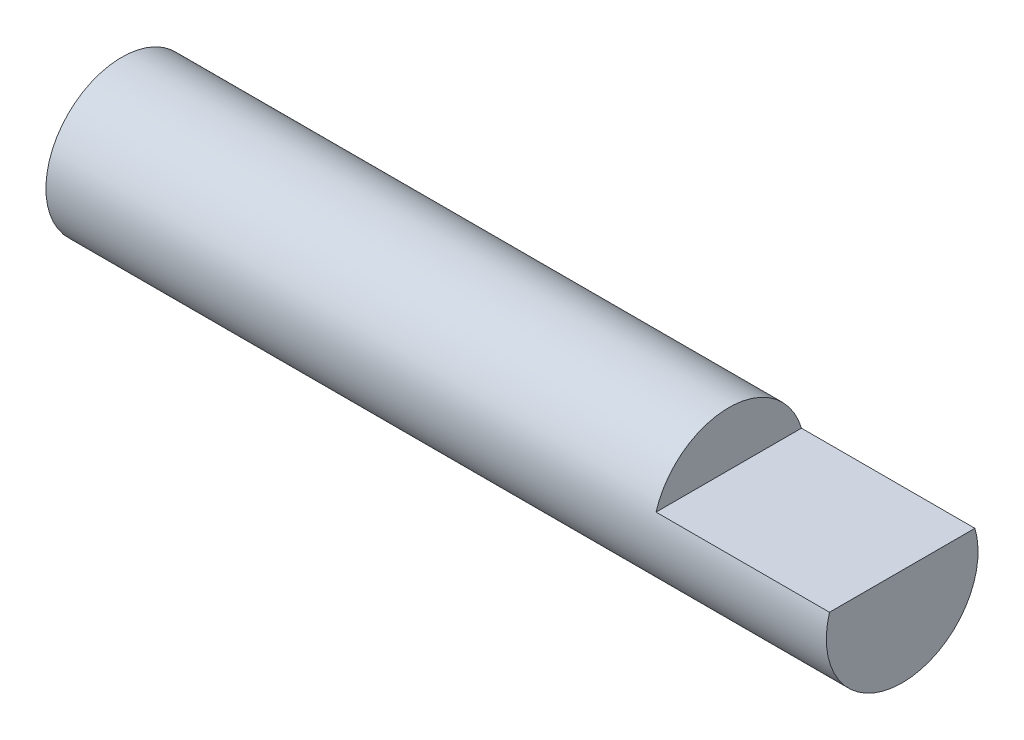
ISO-10303-21;
HEADER;
FILE_DESCRIPTION(('STEP AP214'),'2;1');
FILE_NAME('part.step','',(''),(''),'','','');
FILE_SCHEMA(('AUTOMOTIVE_DESIGN { 1 0 10303 214 1 1 1 1 }'));
ENDSEC;
DATA;
#1=APPLICATION_CONTEXT('core data for automotive mechanical design processes');
#2=APPLICATION_PROTOCOL_DEFINITION('international standard','automotive_design',2000,#1);
#3=PRODUCT_CONTEXT('',#1,'mechanical');
#4=PRODUCT('Part','Part','',(#3));
#5=PRODUCT_RELATED_PRODUCT_CATEGORY('part','',(#4));
#6=PRODUCT_DEFINITION_FORMATION('','',#4);
#7=PRODUCT_DEFINITION_CONTEXT('part definition',#1,'design');
#8=PRODUCT_DEFINITION('design','',#6,#7);
#9=PRODUCT_DEFINITION_SHAPE('','',#8);
#10=(LENGTH_UNIT() NAMED_UNIT(*) SI_UNIT(.MILLI.,.METRE.));
#11=(NAMED_UNIT(*) PLANE_ANGLE_UNIT() SI_UNIT($,.RADIAN.));
#12=(NAMED_UNIT(*) SI_UNIT($,.STERADIAN.) SOLID_ANGLE_UNIT());
#13=UNCERTAINTY_MEASURE_WITH_UNIT(LENGTH_MEASURE(1.E-05),#10,'distance_accuracy_value','');
#14=(GEOMETRIC_REPRESENTATION_CONTEXT(3) GLOBAL_UNCERTAINTY_ASSIGNED_CONTEXT((#13)) GLOBAL_UNIT_ASSIGNED_CONTEXT((#10,
#11,#12)) REPRESENTATION_CONTEXT('',''));
#15=CARTESIAN_POINT('',(0.,0.,0.));
#16=DIRECTION('',(0.,0.,1.));
#17=DIRECTION('',(1.,0.,0.));
#18=AXIS2_PLACEMENT_3D('',#15,#16,#17);
#19=CARTESIAN_POINT('',(57.15,0.,0.));
#20=DIRECTION('',(-1.,0.,0.));
#21=DIRECTION('',(0.,0.,1.));
#22=AXIS2_PLACEMENT_3D('',#19,#20,#21);
#23=CYLINDRICAL_SURFACE('',#22,5.55625);
#24=CARTESIAN_POINT('',(57.15,0.,0.));
#25=DIRECTION('',(1.,0.,0.));
#26=DIRECTION('',(0.,0.,-1.));
#27=AXIS2_PLACEMENT_3D('',#24,#25,#26);
#28=CIRCLE('',#27,5.55625);
#29=CARTESIAN_POINT('',(57.15,1.5875,5.32463687142137));
#30=VERTEX_POINT('',#29);
#31=CARTESIAN_POINT('',(57.15,1.5875,-5.32463687142137));
#32=VERTEX_POINT('',#31);
#33=EDGE_CURVE('E11',#30,#32,#28,.T.);
#34=ORIENTED_EDGE('',*,*,#33,.F.);
#35=DIRECTION('',(1.,0.,0.));
#36=VECTOR('',#35,1.);
#37=CARTESIAN_POINT('',(44.45,1.5875,5.32463687142137));
#38=LINE('',#37,#36);
#39=CARTESIAN_POINT('',(44.45,1.5875,5.32463687142137));
#40=VERTEX_POINT('',#39);
#41=EDGE_CURVE('E50',#40,#30,#38,.T.);
#42=ORIENTED_EDGE('',*,*,#41,.F.);
#43=CARTESIAN_POINT('',(44.45,0.,0.));
#44=DIRECTION('',(1.,0.,0.));
#45=DIRECTION('',(0.,0.,-1.));
#46=AXIS2_PLACEMENT_3D('',#43,#44,#45);
#47=CIRCLE('',#46,5.55625);
#48=CARTESIAN_POINT('',(44.45,1.5875,-5.32463687142137));
#49=VERTEX_POINT('',#48);
#50=EDGE_CURVE('E65',#49,#40,#47,.T.);
#51=ORIENTED_EDGE('',*,*,#50,.F.);
#52=DIRECTION('',(1.,0.,0.));
#53=VECTOR('',#52,1.);
#54=CARTESIAN_POINT('',(44.45,1.5875,-5.32463687142137));
#55=LINE('',#54,#53);
#56=EDGE_CURVE('E56',#49,#32,#55,.T.);
#57=ORIENTED_EDGE('',*,*,#56,.T.);
#58=EDGE_LOOP('',(#34,#42,#51,#57));
#59=FACE_BOUND('',#58,.T.);
#60=CARTESIAN_POINT('',(0.,0.,0.));
#61=DIRECTION('',(1.,0.,0.));
#62=DIRECTION('',(0.,0.,-1.));
#63=AXIS2_PLACEMENT_3D('',#60,#61,#62);
#64=CIRCLE('',#63,5.55625);
#65=CARTESIAN_POINT('',(0.,0.,-5.55625));
#66=VERTEX_POINT('',#65);
#67=EDGE_CURVE('E39',#66,#66,#64,.T.);
#68=ORIENTED_EDGE('',*,*,#67,.T.);
#69=EDGE_LOOP('',(#68));
#70=FACE_BOUND('',#69,.T.);
#71=ADVANCED_FACE('F36',(#59,#70),#23,.T.);
#72=CARTESIAN_POINT('',(57.15,0.,0.));
#73=DIRECTION('',(1.,0.,0.));
#74=DIRECTION('',(0.,0.,-1.));
#75=AXIS2_PLACEMENT_3D('',#72,#73,#74);
#76=PLANE('',#75);
#77=DIRECTION('',(0.,0.,-1.));
#78=VECTOR('',#77,1.);
#79=CARTESIAN_POINT('',(57.15,1.5875,5.32463687142137));
#80=LINE('',#79,#78);
#81=EDGE_CURVE('E61',#30,#32,#80,.T.);
#82=ORIENTED_EDGE('',*,*,#81,.F.);
#83=ORIENTED_EDGE('',*,*,#33,.T.);
#84=EDGE_LOOP('',(#82,#83));
#85=FACE_BOUND('',#84,.T.);
#86=ADVANCED_FACE('F72',(#85),#76,.T.);
#87=CARTESIAN_POINT('',(0.,0.,0.));
#88=DIRECTION('',(1.,0.,0.));
#89=DIRECTION('',(0.,0.,-1.));
#90=AXIS2_PLACEMENT_3D('',#87,#88,#89);
#91=PLANE('',#90);
#92=ORIENTED_EDGE('',*,*,#67,.F.);
#93=EDGE_LOOP('',(#92));
#94=FACE_BOUND('',#93,.T.);
#95=ADVANCED_FACE('F74',(#94),#91,.F.);
#96=CARTESIAN_POINT('',(44.45,1.5875,5.32463687142137));
#97=DIRECTION('',(0.,-1.,0.));
#98=DIRECTION('',(0.,0.,-1.));
#99=AXIS2_PLACEMENT_3D('',#96,#97,#98);
#100=PLANE('',#99);
#101=ORIENTED_EDGE('',*,*,#81,.T.);
#102=ORIENTED_EDGE('',*,*,#56,.F.);
#103=DIRECTION('',(0.,0.,-1.));
#104=VECTOR('',#103,1.);
#105=CARTESIAN_POINT('',(44.45,1.5875,5.32463687142137));
#106=LINE('',#105,#104);
#107=EDGE_CURVE('E89',#40,#49,#106,.T.);
#108=ORIENTED_EDGE('',*,*,#107,.F.);
#109=ORIENTED_EDGE('',*,*,#41,.T.);
#110=EDGE_LOOP('',(#101,#102,#108,#109));
#111=FACE_BOUND('',#110,.T.);
#112=ADVANCED_FACE('F62',(#111),#100,.F.);
#113=CARTESIAN_POINT('',(44.45,0.,0.));
#114=DIRECTION('',(1.,0.,0.));
#115=DIRECTION('',(0.,0.,-1.));
#116=AXIS2_PLACEMENT_3D('',#113,#114,#115);
#117=PLANE('',#116);
#118=ORIENTED_EDGE('',*,*,#50,.T.);
#119=ORIENTED_EDGE('',*,*,#107,.T.);
#120=EDGE_LOOP('',(#118,#119));
#121=FACE_BOUND('',#120,.T.);
#122=ADVANCED_FACE('F84',(#121),#117,.T.);
#123=CLOSED_SHELL('',(#71,#86,#95,#112,#122));
#124=MANIFOLD_SOLID_BREP('B2',#123);
#125=ADVANCED_BREP_SHAPE_REPRESENTATION('',(#18,#124),#14);
#126=SHAPE_DEFINITION_REPRESENTATION(#9,#125);
ENDSEC;
END-ISO-10303-21;
